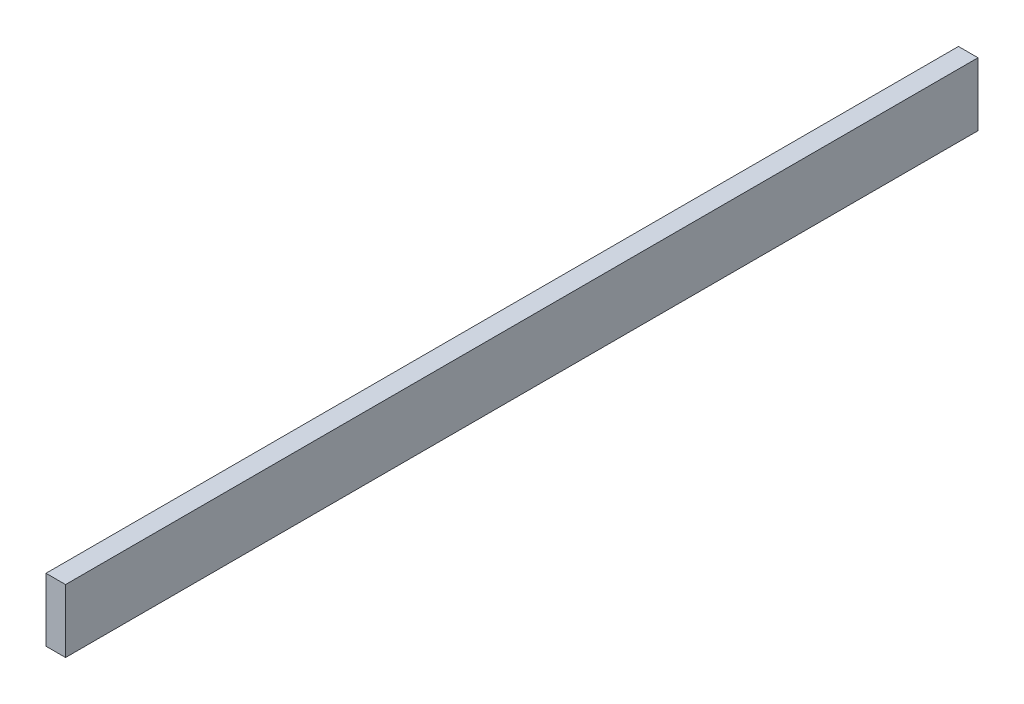
ISO-10303-21;
HEADER;
FILE_DESCRIPTION(('STEP AP214'),'2;1');
FILE_NAME('part.step','',(''),(''),'','','');
FILE_SCHEMA(('AUTOMOTIVE_DESIGN { 1 0 10303 214 1 1 1 1 }'));
ENDSEC;
DATA;
#1=APPLICATION_CONTEXT('core data for automotive mechanical design processes');
#2=APPLICATION_PROTOCOL_DEFINITION('international standard','automotive_design',2000,#1);
#3=PRODUCT_CONTEXT('',#1,'mechanical');
#4=PRODUCT('Part','Part','',(#3));
#5=PRODUCT_RELATED_PRODUCT_CATEGORY('part','',(#4));
#6=PRODUCT_DEFINITION_FORMATION('','',#4);
#7=PRODUCT_DEFINITION_CONTEXT('part definition',#1,'design');
#8=PRODUCT_DEFINITION('design','',#6,#7);
#9=PRODUCT_DEFINITION_SHAPE('','',#8);
#10=(LENGTH_UNIT() NAMED_UNIT(*) SI_UNIT(.MILLI.,.METRE.));
#11=(NAMED_UNIT(*) PLANE_ANGLE_UNIT() SI_UNIT($,.RADIAN.));
#12=(NAMED_UNIT(*) SI_UNIT($,.STERADIAN.) SOLID_ANGLE_UNIT());
#13=UNCERTAINTY_MEASURE_WITH_UNIT(LENGTH_MEASURE(1.E-05),#10,'distance_accuracy_value','');
#14=(GEOMETRIC_REPRESENTATION_CONTEXT(3) GLOBAL_UNCERTAINTY_ASSIGNED_CONTEXT((#13)) GLOBAL_UNIT_ASSIGNED_CONTEXT((#10,
#11,#12)) REPRESENTATION_CONTEXT('',''));
#15=CARTESIAN_POINT('',(0.,0.,0.));
#16=DIRECTION('',(0.,0.,1.));
#17=DIRECTION('',(1.,0.,0.));
#18=AXIS2_PLACEMENT_3D('',#15,#16,#17);
#19=CARTESIAN_POINT('',(-9.,29.1,840.));
#20=DIRECTION('',(1.,0.,0.));
#21=DIRECTION('',(0.,1.,0.));
#22=AXIS2_PLACEMENT_3D('',#19,#20,#21);
#23=PLANE('',#22);
#24=DIRECTION('',(0.,-1.,0.));
#25=VECTOR('',#24,1.);
#26=CARTESIAN_POINT('',(-9.,29.1,0.));
#27=LINE('',#26,#25);
#28=CARTESIAN_POINT('',(-9.,29.1,0.));
#29=VERTEX_POINT('',#28);
#30=CARTESIAN_POINT('',(-9.,-29.1,0.));
#31=VERTEX_POINT('',#30);
#32=EDGE_CURVE('E100',#29,#31,#27,.T.);
#33=ORIENTED_EDGE('',*,*,#32,.T.);
#34=DIRECTION('',(0.,0.,-1.));
#35=VECTOR('',#34,1.);
#36=CARTESIAN_POINT('',(-9.,-29.1,840.));
#37=LINE('',#36,#35);
#38=CARTESIAN_POINT('',(-9.,-29.1,840.));
#39=VERTEX_POINT('',#38);
#40=EDGE_CURVE('E11',#39,#31,#37,.T.);
#41=ORIENTED_EDGE('',*,*,#40,.F.);
#42=DIRECTION('',(0.,-1.,0.));
#43=VECTOR('',#42,1.);
#44=CARTESIAN_POINT('',(-9.,29.1,840.));
#45=LINE('',#44,#43);
#46=CARTESIAN_POINT('',(-9.,29.1,840.));
#47=VERTEX_POINT('',#46);
#48=EDGE_CURVE('E88',#47,#39,#45,.T.);
#49=ORIENTED_EDGE('',*,*,#48,.F.);
#50=DIRECTION('',(0.,0.,-1.));
#51=VECTOR('',#50,1.);
#52=CARTESIAN_POINT('',(-9.,29.1,840.));
#53=LINE('',#52,#51);
#54=EDGE_CURVE('E96',#47,#29,#53,.T.);
#55=ORIENTED_EDGE('',*,*,#54,.T.);
#56=EDGE_LOOP('',(#33,#41,#49,#55));
#57=FACE_BOUND('',#56,.T.);
#58=ADVANCED_FACE('F37',(#57),#23,.F.);
#59=CARTESIAN_POINT('',(9.,-29.1,840.));
#60=DIRECTION('',(0.,1.,0.));
#61=DIRECTION('',(-1.,0.,0.));
#62=AXIS2_PLACEMENT_3D('',#59,#60,#61);
#63=PLANE('',#62);
#64=DIRECTION('',(1.,0.,0.));
#65=VECTOR('',#64,1.);
#66=CARTESIAN_POINT('',(9.,-29.1,0.));
#67=LINE('',#66,#65);
#68=CARTESIAN_POINT('',(9.,-29.1,0.));
#69=VERTEX_POINT('',#68);
#70=EDGE_CURVE('E92',#31,#69,#67,.T.);
#71=ORIENTED_EDGE('',*,*,#70,.T.);
#72=DIRECTION('',(0.,0.,-1.));
#73=VECTOR('',#72,1.);
#74=CARTESIAN_POINT('',(9.,-29.1,840.));
#75=LINE('',#74,#73);
#76=CARTESIAN_POINT('',(9.,-29.1,840.));
#77=VERTEX_POINT('',#76);
#78=EDGE_CURVE('E45',#77,#69,#75,.T.);
#79=ORIENTED_EDGE('',*,*,#78,.F.);
#80=DIRECTION('',(1.,0.,0.));
#81=VECTOR('',#80,1.);
#82=CARTESIAN_POINT('',(9.,-29.1,840.));
#83=LINE('',#82,#81);
#84=EDGE_CURVE('E83',#39,#77,#83,.T.);
#85=ORIENTED_EDGE('',*,*,#84,.F.);
#86=ORIENTED_EDGE('',*,*,#40,.T.);
#87=EDGE_LOOP('',(#71,#79,#85,#86));
#88=FACE_BOUND('',#87,.T.);
#89=ADVANCED_FACE('F91',(#88),#63,.F.);
#90=CARTESIAN_POINT('',(9.,29.1,840.));
#91=DIRECTION('',(-1.,0.,0.));
#92=DIRECTION('',(0.,-1.,0.));
#93=AXIS2_PLACEMENT_3D('',#90,#91,#92);
#94=PLANE('',#93);
#95=DIRECTION('',(0.,1.,0.));
#96=VECTOR('',#95,1.);
#97=CARTESIAN_POINT('',(9.,29.1,0.));
#98=LINE('',#97,#96);
#99=CARTESIAN_POINT('',(9.,29.1,0.));
#100=VERTEX_POINT('',#99);
#101=EDGE_CURVE('E70',#69,#100,#98,.T.);
#102=ORIENTED_EDGE('',*,*,#101,.T.);
#103=DIRECTION('',(0.,0.,-1.));
#104=VECTOR('',#103,1.);
#105=CARTESIAN_POINT('',(9.,29.1,840.));
#106=LINE('',#105,#104);
#107=CARTESIAN_POINT('',(9.,29.1,840.));
#108=VERTEX_POINT('',#107);
#109=EDGE_CURVE('E93',#108,#100,#106,.T.);
#110=ORIENTED_EDGE('',*,*,#109,.F.);
#111=DIRECTION('',(0.,1.,0.));
#112=VECTOR('',#111,1.);
#113=CARTESIAN_POINT('',(9.,29.1,840.));
#114=LINE('',#113,#112);
#115=EDGE_CURVE('E86',#77,#108,#114,.T.);
#116=ORIENTED_EDGE('',*,*,#115,.F.);
#117=ORIENTED_EDGE('',*,*,#78,.T.);
#118=EDGE_LOOP('',(#102,#110,#116,#117));
#119=FACE_BOUND('',#118,.T.);
#120=ADVANCED_FACE('F94',(#119),#94,.F.);
#121=CARTESIAN_POINT('',(9.,29.1,840.));
#122=DIRECTION('',(0.,-1.,0.));
#123=DIRECTION('',(1.,0.,0.));
#124=AXIS2_PLACEMENT_3D('',#121,#122,#123);
#125=PLANE('',#124);
#126=DIRECTION('',(-1.,0.,0.));
#127=VECTOR('',#126,1.);
#128=CARTESIAN_POINT('',(9.,29.1,0.));
#129=LINE('',#128,#127);
#130=EDGE_CURVE('E76',#100,#29,#129,.T.);
#131=ORIENTED_EDGE('',*,*,#130,.T.);
#132=ORIENTED_EDGE('',*,*,#54,.F.);
#133=DIRECTION('',(-1.,0.,0.));
#134=VECTOR('',#133,1.);
#135=CARTESIAN_POINT('',(9.,29.1,840.));
#136=LINE('',#135,#134);
#137=EDGE_CURVE('E53',#108,#47,#136,.T.);
#138=ORIENTED_EDGE('',*,*,#137,.F.);
#139=ORIENTED_EDGE('',*,*,#109,.T.);
#140=EDGE_LOOP('',(#131,#132,#138,#139));
#141=FACE_BOUND('',#140,.T.);
#142=ADVANCED_FACE('F107',(#141),#125,.F.);
#143=CARTESIAN_POINT('',(0.,0.,840.));
#144=DIRECTION('',(0.,0.,-1.));
#145=DIRECTION('',(-1.,0.,0.));
#146=AXIS2_PLACEMENT_3D('',#143,#144,#145);
#147=PLANE('',#146);
#148=ORIENTED_EDGE('',*,*,#48,.T.);
#149=ORIENTED_EDGE('',*,*,#84,.T.);
#150=ORIENTED_EDGE('',*,*,#115,.T.);
#151=ORIENTED_EDGE('',*,*,#137,.T.);
#152=EDGE_LOOP('',(#148,#149,#150,#151));
#153=FACE_BOUND('',#152,.T.);
#154=ADVANCED_FACE('F84',(#153),#147,.F.);
#155=CARTESIAN_POINT('',(0.,0.,0.));
#156=DIRECTION('',(0.,0.,-1.));
#157=DIRECTION('',(-1.,0.,0.));
#158=AXIS2_PLACEMENT_3D('',#155,#156,#157);
#159=PLANE('',#158);
#160=ORIENTED_EDGE('',*,*,#32,.F.);
#161=ORIENTED_EDGE('',*,*,#130,.F.);
#162=ORIENTED_EDGE('',*,*,#101,.F.);
#163=ORIENTED_EDGE('',*,*,#70,.F.);
#164=EDGE_LOOP('',(#160,#161,#162,#163));
#165=FACE_BOUND('',#164,.T.);
#166=ADVANCED_FACE('F110',(#165),#159,.T.);
#167=CLOSED_SHELL('',(#58,#89,#120,#142,#154,#166));
#168=MANIFOLD_SOLID_BREP('B2',#167);
#169=ADVANCED_BREP_SHAPE_REPRESENTATION('',(#18,#168),#14);
#170=SHAPE_DEFINITION_REPRESENTATION(#9,#169);
ENDSEC;
END-ISO-10303-21;
